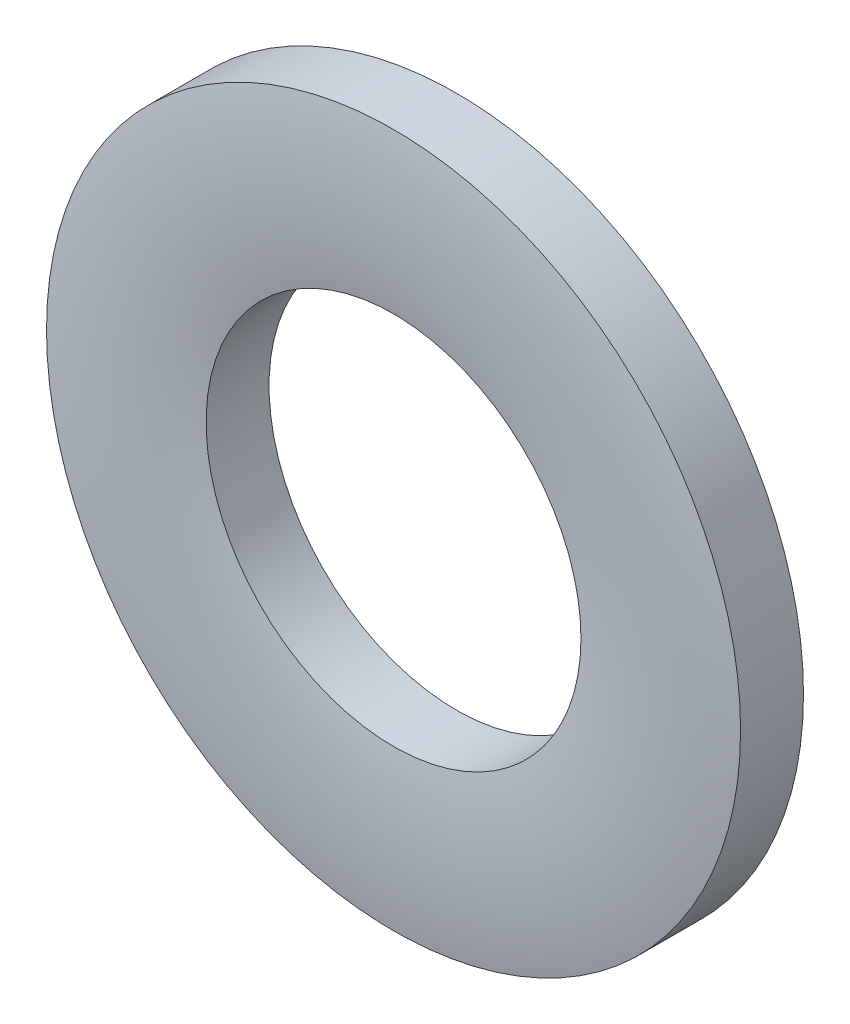
ISO-10303-21;
HEADER;
FILE_DESCRIPTION(('STEP AP214'),'2;1');
FILE_NAME('part.step','',(''),(''),'','','');
FILE_SCHEMA(('AUTOMOTIVE_DESIGN { 1 0 10303 214 1 1 1 1 }'));
ENDSEC;
DATA;
#1=APPLICATION_CONTEXT('core data for automotive mechanical design processes');
#2=APPLICATION_PROTOCOL_DEFINITION('international standard','automotive_design',2000,#1);
#3=PRODUCT_CONTEXT('',#1,'mechanical');
#4=PRODUCT('Part','Part','',(#3));
#5=PRODUCT_RELATED_PRODUCT_CATEGORY('part','',(#4));
#6=PRODUCT_DEFINITION_FORMATION('','',#4);
#7=PRODUCT_DEFINITION_CONTEXT('part definition',#1,'design');
#8=PRODUCT_DEFINITION('design','',#6,#7);
#9=PRODUCT_DEFINITION_SHAPE('','',#8);
#10=(LENGTH_UNIT() NAMED_UNIT(*) SI_UNIT(.MILLI.,.METRE.));
#11=(NAMED_UNIT(*) PLANE_ANGLE_UNIT() SI_UNIT($,.RADIAN.));
#12=(NAMED_UNIT(*) SI_UNIT($,.STERADIAN.) SOLID_ANGLE_UNIT());
#13=UNCERTAINTY_MEASURE_WITH_UNIT(LENGTH_MEASURE(1.E-05),#10,'distance_accuracy_value','');
#14=(GEOMETRIC_REPRESENTATION_CONTEXT(3) GLOBAL_UNCERTAINTY_ASSIGNED_CONTEXT((#13)) GLOBAL_UNIT_ASSIGNED_CONTEXT((#10,
#11,#12)) REPRESENTATION_CONTEXT('',''));
#15=CARTESIAN_POINT('',(0.,0.,0.));
#16=DIRECTION('',(0.,0.,1.));
#17=DIRECTION('',(1.,0.,0.));
#18=AXIS2_PLACEMENT_3D('',#15,#16,#17);
#19=CARTESIAN_POINT('',(0.,1.35,-0.25));
#20=DIRECTION('',(0.,0.,1.));
#21=DIRECTION('',(1.,0.,0.));
#22=AXIS2_PLACEMENT_3D('',#19,#20,#21);
#23=PLANE('',#22);
#24=CARTESIAN_POINT('',(0.,0.,-0.25));
#25=DIRECTION('',(0.,0.,1.));
#26=DIRECTION('',(1.,0.,0.));
#27=AXIS2_PLACEMENT_3D('',#24,#25,#26);
#28=CIRCLE('',#27,2.5);
#29=CARTESIAN_POINT('',(2.5,0.,-0.25));
#30=VERTEX_POINT('',#29);
#31=EDGE_CURVE('E48',#30,#30,#28,.T.);
#32=ORIENTED_EDGE('',*,*,#31,.F.);
#33=EDGE_LOOP('',(#32));
#34=FACE_BOUND('',#33,.T.);
#35=CARTESIAN_POINT('',(0.,0.,-0.25));
#36=DIRECTION('',(0.,0.,1.));
#37=DIRECTION('',(1.,0.,0.));
#38=AXIS2_PLACEMENT_3D('',#35,#36,#37);
#39=CIRCLE('',#38,1.35);
#40=CARTESIAN_POINT('',(1.35,0.,-0.25));
#41=VERTEX_POINT('',#40);
#42=EDGE_CURVE('E10',#41,#41,#39,.T.);
#43=ORIENTED_EDGE('',*,*,#42,.T.);
#44=EDGE_LOOP('',(#43));
#45=FACE_BOUND('',#44,.T.);
#46=ADVANCED_FACE('F34',(#34,#45),#23,.F.);
#47=CARTESIAN_POINT('',(0.,0.,0.25));
#48=DIRECTION('',(0.,0.,1.));
#49=DIRECTION('',(1.,0.,0.));
#50=AXIS2_PLACEMENT_3D('',#47,#48,#49);
#51=CYLINDRICAL_SURFACE('',#50,1.35);
#52=ORIENTED_EDGE('',*,*,#42,.F.);
#53=EDGE_LOOP('',(#52));
#54=FACE_BOUND('',#53,.T.);
#55=CARTESIAN_POINT('',(0.,0.,0.20315));
#56=DIRECTION('',(0.,0.,1.));
#57=DIRECTION('',(1.,0.,0.));
#58=AXIS2_PLACEMENT_3D('',#55,#56,#57);
#59=CIRCLE('',#58,1.35);
#60=CARTESIAN_POINT('',(1.35,0.,0.20315));
#61=VERTEX_POINT('',#60);
#62=EDGE_CURVE('E40',#61,#61,#59,.T.);
#63=ORIENTED_EDGE('',*,*,#62,.T.);
#64=EDGE_LOOP('',(#63));
#65=FACE_BOUND('',#64,.T.);
#66=ADVANCED_FACE('F57',(#54,#65),#51,.F.);
#67=CARTESIAN_POINT('',(0.,0.,-3.3019735592316));
#68=DIRECTION('',(0.,0.,1.));
#69=DIRECTION('',(1.,0.,0.));
#70=AXIS2_PLACEMENT_3D('',#67,#68,#69);
#71=DEGENERATE_TOROIDAL_SURFACE('',#70,1.925,3.5519735592316,.T.);
#72=ORIENTED_EDGE('',*,*,#62,.F.);
#73=EDGE_LOOP('',(#72));
#74=FACE_BOUND('',#73,.T.);
#75=CARTESIAN_POINT('',(0.,0.,0.20315));
#76=DIRECTION('',(0.,0.,1.));
#77=DIRECTION('',(1.,0.,0.));
#78=AXIS2_PLACEMENT_3D('',#75,#76,#77);
#79=CIRCLE('',#78,2.5);
#80=CARTESIAN_POINT('',(2.5,0.,0.20315));
#81=VERTEX_POINT('',#80);
#82=EDGE_CURVE('E44',#81,#81,#79,.T.);
#83=ORIENTED_EDGE('',*,*,#82,.T.);
#84=EDGE_LOOP('',(#83));
#85=FACE_BOUND('',#84,.T.);
#86=ADVANCED_FACE('F61',(#74,#85),#71,.T.);
#87=CARTESIAN_POINT('',(0.,0.,0.25));
#88=DIRECTION('',(0.,0.,1.));
#89=DIRECTION('',(1.,0.,0.));
#90=AXIS2_PLACEMENT_3D('',#87,#88,#89);
#91=CYLINDRICAL_SURFACE('',#90,2.5);
#92=ORIENTED_EDGE('',*,*,#82,.F.);
#93=EDGE_LOOP('',(#92));
#94=FACE_BOUND('',#93,.T.);
#95=ORIENTED_EDGE('',*,*,#31,.T.);
#96=EDGE_LOOP('',(#95));
#97=FACE_BOUND('',#96,.T.);
#98=ADVANCED_FACE('F54',(#94,#97),#91,.T.);
#99=CLOSED_SHELL('',(#46,#66,#86,#98));
#100=MANIFOLD_SOLID_BREP('B2',#99);
#101=ADVANCED_BREP_SHAPE_REPRESENTATION('',(#18,#100),#14);
#102=SHAPE_DEFINITION_REPRESENTATION(#9,#101);
ENDSEC;
END-ISO-10303-21;
